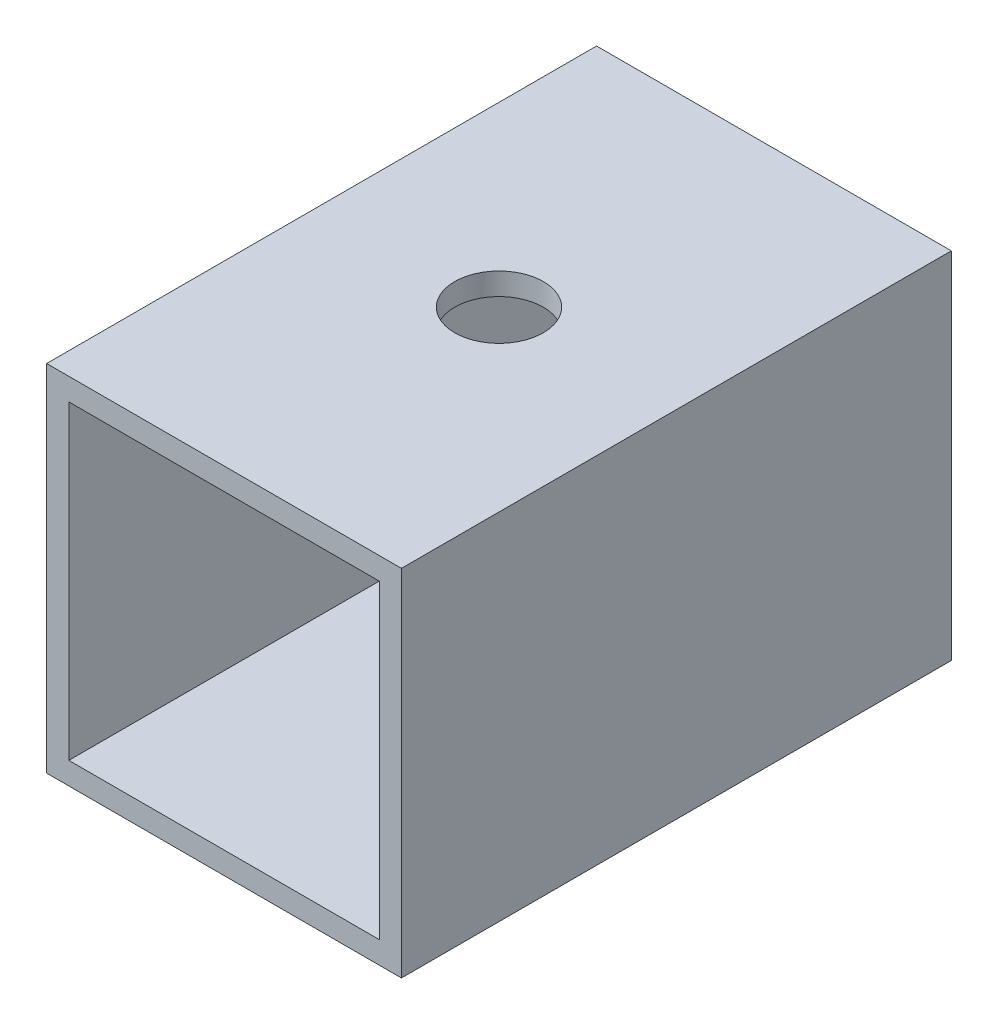
ISO-10303-21;
HEADER;
FILE_DESCRIPTION(('STEP AP214'),'2;1');
FILE_NAME('part.step','',(''),(''),'','','');
FILE_SCHEMA(('AUTOMOTIVE_DESIGN { 1 0 10303 214 1 1 1 1 }'));
ENDSEC;
DATA;
#1=APPLICATION_CONTEXT('core data for automotive mechanical design processes');
#2=APPLICATION_PROTOCOL_DEFINITION('international standard','automotive_design',2000,#1);
#3=PRODUCT_CONTEXT('',#1,'mechanical');
#4=PRODUCT('Part','Part','',(#3));
#5=PRODUCT_RELATED_PRODUCT_CATEGORY('part','',(#4));
#6=PRODUCT_DEFINITION_FORMATION('','',#4);
#7=PRODUCT_DEFINITION_CONTEXT('part definition',#1,'design');
#8=PRODUCT_DEFINITION('design','',#6,#7);
#9=PRODUCT_DEFINITION_SHAPE('','',#8);
#10=(LENGTH_UNIT() NAMED_UNIT(*) SI_UNIT(.MILLI.,.METRE.));
#11=(NAMED_UNIT(*) PLANE_ANGLE_UNIT() SI_UNIT($,.RADIAN.));
#12=(NAMED_UNIT(*) SI_UNIT($,.STERADIAN.) SOLID_ANGLE_UNIT());
#13=UNCERTAINTY_MEASURE_WITH_UNIT(LENGTH_MEASURE(1.E-05),#10,'distance_accuracy_value','');
#14=(GEOMETRIC_REPRESENTATION_CONTEXT(3) GLOBAL_UNCERTAINTY_ASSIGNED_CONTEXT((#13)) GLOBAL_UNIT_ASSIGNED_CONTEXT((#10,
#11,#12)) REPRESENTATION_CONTEXT('',''));
#15=CARTESIAN_POINT('',(0.,0.,0.));
#16=DIRECTION('',(0.,0.,1.));
#17=DIRECTION('',(1.,0.,0.));
#18=AXIS2_PLACEMENT_3D('',#15,#16,#17);
#19=CARTESIAN_POINT('',(0.,0.,39.37));
#20=DIRECTION('',(0.,0.,1.));
#21=DIRECTION('',(1.,0.,0.));
#22=AXIS2_PLACEMENT_3D('',#19,#20,#21);
#23=PLANE('',#22);
#24=DIRECTION('',(0.,1.,0.));
#25=VECTOR('',#24,1.);
#26=CARTESIAN_POINT('',(12.7,12.7,39.37));
#27=LINE('',#26,#25);
#28=CARTESIAN_POINT('',(12.7,-12.7,39.37));
#29=VERTEX_POINT('',#28);
#30=CARTESIAN_POINT('',(12.7,12.7,39.37));
#31=VERTEX_POINT('',#30);
#32=EDGE_CURVE('E137',#29,#31,#27,.T.);
#33=ORIENTED_EDGE('',*,*,#32,.T.);
#34=DIRECTION('',(-1.,0.,0.));
#35=VECTOR('',#34,1.);
#36=CARTESIAN_POINT('',(-12.7,12.7,39.37));
#37=LINE('',#36,#35);
#38=CARTESIAN_POINT('',(-12.7,12.7,39.37));
#39=VERTEX_POINT('',#38);
#40=EDGE_CURVE('E140',#31,#39,#37,.T.);
#41=ORIENTED_EDGE('',*,*,#40,.T.);
#42=DIRECTION('',(0.,-1.,0.));
#43=VECTOR('',#42,1.);
#44=CARTESIAN_POINT('',(-12.7,12.7,39.37));
#45=LINE('',#44,#43);
#46=CARTESIAN_POINT('',(-12.7,-12.7,39.37));
#47=VERTEX_POINT('',#46);
#48=EDGE_CURVE('E143',#39,#47,#45,.T.);
#49=ORIENTED_EDGE('',*,*,#48,.T.);
#50=DIRECTION('',(1.,0.,0.));
#51=VECTOR('',#50,1.);
#52=CARTESIAN_POINT('',(-12.7,-12.7,39.37));
#53=LINE('',#52,#51);
#54=EDGE_CURVE('E145',#47,#29,#53,.T.);
#55=ORIENTED_EDGE('',*,*,#54,.T.);
#56=EDGE_LOOP('',(#33,#41,#49,#55));
#57=FACE_BOUND('',#56,.T.);
#58=DIRECTION('',(-1.,0.,0.));
#59=VECTOR('',#58,1.);
#60=CARTESIAN_POINT('',(-11.1125,11.1125,39.37));
#61=LINE('',#60,#59);
#62=CARTESIAN_POINT('',(11.1125,11.1125,39.37));
#63=VERTEX_POINT('',#62);
#64=CARTESIAN_POINT('',(-11.1125,11.1125,39.37));
#65=VERTEX_POINT('',#64);
#66=EDGE_CURVE('E107',#63,#65,#61,.T.);
#67=ORIENTED_EDGE('',*,*,#66,.F.);
#68=DIRECTION('',(0.,1.,0.));
#69=VECTOR('',#68,1.);
#70=CARTESIAN_POINT('',(11.1125,11.1125,39.37));
#71=LINE('',#70,#69);
#72=CARTESIAN_POINT('',(11.1125,-11.1125,39.37));
#73=VERTEX_POINT('',#72);
#74=EDGE_CURVE('E99',#73,#63,#71,.T.);
#75=ORIENTED_EDGE('',*,*,#74,.F.);
#76=DIRECTION('',(1.,0.,0.));
#77=VECTOR('',#76,1.);
#78=CARTESIAN_POINT('',(-11.1125,-11.1125,39.37));
#79=LINE('',#78,#77);
#80=CARTESIAN_POINT('',(-11.1125,-11.1125,39.37));
#81=VERTEX_POINT('',#80);
#82=EDGE_CURVE('E121',#81,#73,#79,.T.);
#83=ORIENTED_EDGE('',*,*,#82,.F.);
#84=DIRECTION('',(0.,-1.,0.));
#85=VECTOR('',#84,1.);
#86=CARTESIAN_POINT('',(-11.1125,11.1125,39.37));
#87=LINE('',#86,#85);
#88=EDGE_CURVE('E119',#65,#81,#87,.T.);
#89=ORIENTED_EDGE('',*,*,#88,.F.);
#90=EDGE_LOOP('',(#67,#75,#83,#89));
#91=FACE_BOUND('',#90,.T.);
#92=ADVANCED_FACE('F33',(#57,#91),#23,.T.);
#93=CARTESIAN_POINT('',(0.,0.,0.));
#94=DIRECTION('',(0.,0.,1.));
#95=DIRECTION('',(1.,0.,0.));
#96=AXIS2_PLACEMENT_3D('',#93,#94,#95);
#97=PLANE('',#96);
#98=DIRECTION('',(0.,1.,0.));
#99=VECTOR('',#98,1.);
#100=CARTESIAN_POINT('',(12.7,12.7,0.));
#101=LINE('',#100,#99);
#102=CARTESIAN_POINT('',(12.7,-12.7,0.));
#103=VERTEX_POINT('',#102);
#104=CARTESIAN_POINT('',(12.7,12.7,0.));
#105=VERTEX_POINT('',#104);
#106=EDGE_CURVE('E115',#103,#105,#101,.T.);
#107=ORIENTED_EDGE('',*,*,#106,.F.);
#108=DIRECTION('',(1.,0.,0.));
#109=VECTOR('',#108,1.);
#110=CARTESIAN_POINT('',(-12.7,-12.7,0.));
#111=LINE('',#110,#109);
#112=CARTESIAN_POINT('',(-12.7,-12.7,0.));
#113=VERTEX_POINT('',#112);
#114=EDGE_CURVE('E141',#113,#103,#111,.T.);
#115=ORIENTED_EDGE('',*,*,#114,.F.);
#116=DIRECTION('',(0.,-1.,0.));
#117=VECTOR('',#116,1.);
#118=CARTESIAN_POINT('',(-12.7,12.7,0.));
#119=LINE('',#118,#117);
#120=CARTESIAN_POINT('',(-12.7,12.7,0.));
#121=VERTEX_POINT('',#120);
#122=EDGE_CURVE('E152',#121,#113,#119,.T.);
#123=ORIENTED_EDGE('',*,*,#122,.F.);
#124=DIRECTION('',(-1.,0.,0.));
#125=VECTOR('',#124,1.);
#126=CARTESIAN_POINT('',(-12.7,12.7,0.));
#127=LINE('',#126,#125);
#128=EDGE_CURVE('E150',#105,#121,#127,.T.);
#129=ORIENTED_EDGE('',*,*,#128,.F.);
#130=EDGE_LOOP('',(#107,#115,#123,#129));
#131=FACE_BOUND('',#130,.T.);
#132=DIRECTION('',(0.,1.,0.));
#133=VECTOR('',#132,1.);
#134=CARTESIAN_POINT('',(11.1125,11.1125,0.));
#135=LINE('',#134,#133);
#136=CARTESIAN_POINT('',(11.1125,-11.1125,0.));
#137=VERTEX_POINT('',#136);
#138=CARTESIAN_POINT('',(11.1125,11.1125,0.));
#139=VERTEX_POINT('',#138);
#140=EDGE_CURVE('E57',#137,#139,#135,.T.);
#141=ORIENTED_EDGE('',*,*,#140,.T.);
#142=DIRECTION('',(-1.,0.,0.));
#143=VECTOR('',#142,1.);
#144=CARTESIAN_POINT('',(-11.1125,11.1125,0.));
#145=LINE('',#144,#143);
#146=CARTESIAN_POINT('',(-11.1125,11.1125,0.));
#147=VERTEX_POINT('',#146);
#148=EDGE_CURVE('E114',#139,#147,#145,.T.);
#149=ORIENTED_EDGE('',*,*,#148,.T.);
#150=DIRECTION('',(0.,-1.,0.));
#151=VECTOR('',#150,1.);
#152=CARTESIAN_POINT('',(-11.1125,11.1125,0.));
#153=LINE('',#152,#151);
#154=CARTESIAN_POINT('',(-11.1125,-11.1125,0.));
#155=VERTEX_POINT('',#154);
#156=EDGE_CURVE('E129',#147,#155,#153,.T.);
#157=ORIENTED_EDGE('',*,*,#156,.T.);
#158=DIRECTION('',(1.,0.,0.));
#159=VECTOR('',#158,1.);
#160=CARTESIAN_POINT('',(-11.1125,-11.1125,0.));
#161=LINE('',#160,#159);
#162=EDGE_CURVE('E108',#155,#137,#161,.T.);
#163=ORIENTED_EDGE('',*,*,#162,.T.);
#164=EDGE_LOOP('',(#141,#149,#157,#163));
#165=FACE_BOUND('',#164,.T.);
#166=ADVANCED_FACE('F171',(#131,#165),#97,.F.);
#167=CARTESIAN_POINT('',(12.7,12.7,39.37));
#168=DIRECTION('',(-1.,0.,0.));
#169=DIRECTION('',(0.,-1.,0.));
#170=AXIS2_PLACEMENT_3D('',#167,#168,#169);
#171=PLANE('',#170);
#172=ORIENTED_EDGE('',*,*,#106,.T.);
#173=DIRECTION('',(0.,0.,-1.));
#174=VECTOR('',#173,1.);
#175=CARTESIAN_POINT('',(12.7,12.7,39.37));
#176=LINE('',#175,#174);
#177=EDGE_CURVE('E11',#31,#105,#176,.T.);
#178=ORIENTED_EDGE('',*,*,#177,.F.);
#179=ORIENTED_EDGE('',*,*,#32,.F.);
#180=DIRECTION('',(0.,0.,-1.));
#181=VECTOR('',#180,1.);
#182=CARTESIAN_POINT('',(12.7,-12.7,39.37));
#183=LINE('',#182,#181);
#184=EDGE_CURVE('E147',#29,#103,#183,.T.);
#185=ORIENTED_EDGE('',*,*,#184,.T.);
#186=EDGE_LOOP('',(#172,#178,#179,#185));
#187=FACE_BOUND('',#186,.T.);
#188=ADVANCED_FACE('F35',(#187),#171,.F.);
#189=CARTESIAN_POINT('',(-12.7,12.7,39.37));
#190=DIRECTION('',(0.,-1.,0.));
#191=DIRECTION('',(0.,0.,-1.));
#192=AXIS2_PLACEMENT_3D('',#189,#190,#191);
#193=PLANE('',#192);
#194=CARTESIAN_POINT('',(0.,12.7,19.685));
#195=DIRECTION('',(0.,1.,0.));
#196=DIRECTION('',(0.,0.,1.));
#197=AXIS2_PLACEMENT_3D('',#194,#195,#196);
#198=CIRCLE('',#197,3.175);
#199=CARTESIAN_POINT('',(0.,12.7,22.86));
#200=VERTEX_POINT('',#199);
#201=EDGE_CURVE('E208',#200,#200,#198,.T.);
#202=ORIENTED_EDGE('',*,*,#201,.F.);
#203=EDGE_LOOP('',(#202));
#204=FACE_BOUND('',#203,.T.);
#205=ORIENTED_EDGE('',*,*,#128,.T.);
#206=DIRECTION('',(0.,0.,-1.));
#207=VECTOR('',#206,1.);
#208=CARTESIAN_POINT('',(-12.7,12.7,39.37));
#209=LINE('',#208,#207);
#210=EDGE_CURVE('E42',#39,#121,#209,.T.);
#211=ORIENTED_EDGE('',*,*,#210,.F.);
#212=ORIENTED_EDGE('',*,*,#40,.F.);
#213=ORIENTED_EDGE('',*,*,#177,.T.);
#214=EDGE_LOOP('',(#205,#211,#212,#213));
#215=FACE_BOUND('',#214,.T.);
#216=ADVANCED_FACE('F181',(#204,#215),#193,.F.);
#217=CARTESIAN_POINT('',(-12.7,12.7,39.37));
#218=DIRECTION('',(1.,0.,0.));
#219=DIRECTION('',(0.,1.,0.));
#220=AXIS2_PLACEMENT_3D('',#217,#218,#219);
#221=PLANE('',#220);
#222=ORIENTED_EDGE('',*,*,#122,.T.);
#223=DIRECTION('',(0.,0.,-1.));
#224=VECTOR('',#223,1.);
#225=CARTESIAN_POINT('',(-12.7,-12.7,39.37));
#226=LINE('',#225,#224);
#227=EDGE_CURVE('E157',#47,#113,#226,.T.);
#228=ORIENTED_EDGE('',*,*,#227,.F.);
#229=ORIENTED_EDGE('',*,*,#48,.F.);
#230=ORIENTED_EDGE('',*,*,#210,.T.);
#231=EDGE_LOOP('',(#222,#228,#229,#230));
#232=FACE_BOUND('',#231,.T.);
#233=ADVANCED_FACE('F165',(#232),#221,.F.);
#234=CARTESIAN_POINT('',(-12.7,-12.7,39.37));
#235=DIRECTION('',(0.,1.,0.));
#236=DIRECTION('',(0.,0.,1.));
#237=AXIS2_PLACEMENT_3D('',#234,#235,#236);
#238=PLANE('',#237);
#239=CARTESIAN_POINT('',(0.,-12.7,19.685));
#240=DIRECTION('',(0.,1.,0.));
#241=DIRECTION('',(0.,0.,1.));
#242=AXIS2_PLACEMENT_3D('',#239,#240,#241);
#243=CIRCLE('',#242,3.175);
#244=CARTESIAN_POINT('',(0.,-12.7,22.86));
#245=VERTEX_POINT('',#244);
#246=EDGE_CURVE('E206',#245,#245,#243,.T.);
#247=ORIENTED_EDGE('',*,*,#246,.T.);
#248=EDGE_LOOP('',(#247));
#249=FACE_BOUND('',#248,.T.);
#250=ORIENTED_EDGE('',*,*,#114,.T.);
#251=ORIENTED_EDGE('',*,*,#184,.F.);
#252=ORIENTED_EDGE('',*,*,#54,.F.);
#253=ORIENTED_EDGE('',*,*,#227,.T.);
#254=EDGE_LOOP('',(#250,#251,#252,#253));
#255=FACE_BOUND('',#254,.T.);
#256=ADVANCED_FACE('F175',(#249,#255),#238,.F.);
#257=CARTESIAN_POINT('',(11.1125,11.1125,39.37));
#258=DIRECTION('',(-1.,0.,0.));
#259=DIRECTION('',(0.,-1.,0.));
#260=AXIS2_PLACEMENT_3D('',#257,#258,#259);
#261=PLANE('',#260);
#262=ORIENTED_EDGE('',*,*,#140,.F.);
#263=DIRECTION('',(0.,0.,-1.));
#264=VECTOR('',#263,1.);
#265=CARTESIAN_POINT('',(11.1125,-11.1125,39.37));
#266=LINE('',#265,#264);
#267=EDGE_CURVE('E103',#73,#137,#266,.T.);
#268=ORIENTED_EDGE('',*,*,#267,.F.);
#269=ORIENTED_EDGE('',*,*,#74,.T.);
#270=DIRECTION('',(0.,0.,-1.));
#271=VECTOR('',#270,1.);
#272=CARTESIAN_POINT('',(11.1125,11.1125,39.37));
#273=LINE('',#272,#271);
#274=EDGE_CURVE('E102',#63,#139,#273,.T.);
#275=ORIENTED_EDGE('',*,*,#274,.T.);
#276=EDGE_LOOP('',(#262,#268,#269,#275));
#277=FACE_BOUND('',#276,.T.);
#278=ADVANCED_FACE('F101',(#277),#261,.T.);
#279=CARTESIAN_POINT('',(-11.1125,11.1125,39.37));
#280=DIRECTION('',(0.,-1.,0.));
#281=DIRECTION('',(0.,0.,-1.));
#282=AXIS2_PLACEMENT_3D('',#279,#280,#281);
#283=PLANE('',#282);
#284=CARTESIAN_POINT('',(0.,11.1125,19.685));
#285=DIRECTION('',(0.,-1.,0.));
#286=DIRECTION('',(0.,0.,-1.));
#287=AXIS2_PLACEMENT_3D('',#284,#285,#286);
#288=CIRCLE('',#287,3.175);
#289=CARTESIAN_POINT('',(0.,11.1125,16.51));
#290=VERTEX_POINT('',#289);
#291=EDGE_CURVE('E127',#290,#290,#288,.T.);
#292=ORIENTED_EDGE('',*,*,#291,.F.);
#293=EDGE_LOOP('',(#292));
#294=FACE_BOUND('',#293,.T.);
#295=ORIENTED_EDGE('',*,*,#148,.F.);
#296=ORIENTED_EDGE('',*,*,#274,.F.);
#297=ORIENTED_EDGE('',*,*,#66,.T.);
#298=DIRECTION('',(0.,0.,-1.));
#299=VECTOR('',#298,1.);
#300=CARTESIAN_POINT('',(-11.1125,11.1125,39.37));
#301=LINE('',#300,#299);
#302=EDGE_CURVE('E116',#65,#147,#301,.T.);
#303=ORIENTED_EDGE('',*,*,#302,.T.);
#304=EDGE_LOOP('',(#295,#296,#297,#303));
#305=FACE_BOUND('',#304,.T.);
#306=ADVANCED_FACE('F111',(#294,#305),#283,.T.);
#307=CARTESIAN_POINT('',(-11.1125,11.1125,39.37));
#308=DIRECTION('',(1.,0.,0.));
#309=DIRECTION('',(0.,1.,0.));
#310=AXIS2_PLACEMENT_3D('',#307,#308,#309);
#311=PLANE('',#310);
#312=ORIENTED_EDGE('',*,*,#156,.F.);
#313=ORIENTED_EDGE('',*,*,#302,.F.);
#314=ORIENTED_EDGE('',*,*,#88,.T.);
#315=DIRECTION('',(0.,0.,-1.));
#316=VECTOR('',#315,1.);
#317=CARTESIAN_POINT('',(-11.1125,-11.1125,39.37));
#318=LINE('',#317,#316);
#319=EDGE_CURVE('E49',#81,#155,#318,.T.);
#320=ORIENTED_EDGE('',*,*,#319,.T.);
#321=EDGE_LOOP('',(#312,#313,#314,#320));
#322=FACE_BOUND('',#321,.T.);
#323=ADVANCED_FACE('F220',(#322),#311,.T.);
#324=CARTESIAN_POINT('',(-11.1125,-11.1125,39.37));
#325=DIRECTION('',(0.,1.,0.));
#326=DIRECTION('',(0.,0.,1.));
#327=AXIS2_PLACEMENT_3D('',#324,#325,#326);
#328=PLANE('',#327);
#329=CARTESIAN_POINT('',(0.,-11.1125,19.685));
#330=DIRECTION('',(0.,1.,0.));
#331=DIRECTION('',(0.,0.,1.));
#332=AXIS2_PLACEMENT_3D('',#329,#330,#331);
#333=CIRCLE('',#332,3.175);
#334=CARTESIAN_POINT('',(0.,-11.1125,22.86));
#335=VERTEX_POINT('',#334);
#336=EDGE_CURVE('E37',#335,#335,#333,.T.);
#337=ORIENTED_EDGE('',*,*,#336,.F.);
#338=EDGE_LOOP('',(#337));
#339=FACE_BOUND('',#338,.T.);
#340=ORIENTED_EDGE('',*,*,#162,.F.);
#341=ORIENTED_EDGE('',*,*,#319,.F.);
#342=ORIENTED_EDGE('',*,*,#82,.T.);
#343=ORIENTED_EDGE('',*,*,#267,.T.);
#344=EDGE_LOOP('',(#340,#341,#342,#343));
#345=FACE_BOUND('',#344,.T.);
#346=ADVANCED_FACE('F224',(#339,#345),#328,.T.);
#347=CARTESIAN_POINT('',(0.,-12.7,19.685));
#348=DIRECTION('',(0.,1.,0.));
#349=DIRECTION('',(0.,0.,1.));
#350=AXIS2_PLACEMENT_3D('',#347,#348,#349);
#351=CYLINDRICAL_SURFACE('',#350,3.175);
#352=ORIENTED_EDGE('',*,*,#336,.T.);
#353=EDGE_LOOP('',(#352));
#354=FACE_BOUND('',#353,.T.);
#355=ORIENTED_EDGE('',*,*,#246,.F.);
#356=EDGE_LOOP('',(#355));
#357=FACE_BOUND('',#356,.T.);
#358=ADVANCED_FACE('F230',(#354,#357),#351,.F.);
#359=ORIENTED_EDGE('',*,*,#291,.T.);
#360=EDGE_LOOP('',(#359));
#361=FACE_BOUND('',#360,.T.);
#362=ORIENTED_EDGE('',*,*,#201,.T.);
#363=EDGE_LOOP('',(#362));
#364=FACE_BOUND('',#363,.T.);
#365=ADVANCED_FACE('F216',(#361,#364),#351,.F.);
#366=CLOSED_SHELL('',(#92,#166,#188,#216,#233,#256,#278,#306,#323,#346,#358,#365));
#367=MANIFOLD_SOLID_BREP('B2',#366);
#368=ADVANCED_BREP_SHAPE_REPRESENTATION('',(#18,#367),#14);
#369=SHAPE_DEFINITION_REPRESENTATION(#9,#368);
ENDSEC;
END-ISO-10303-21;
